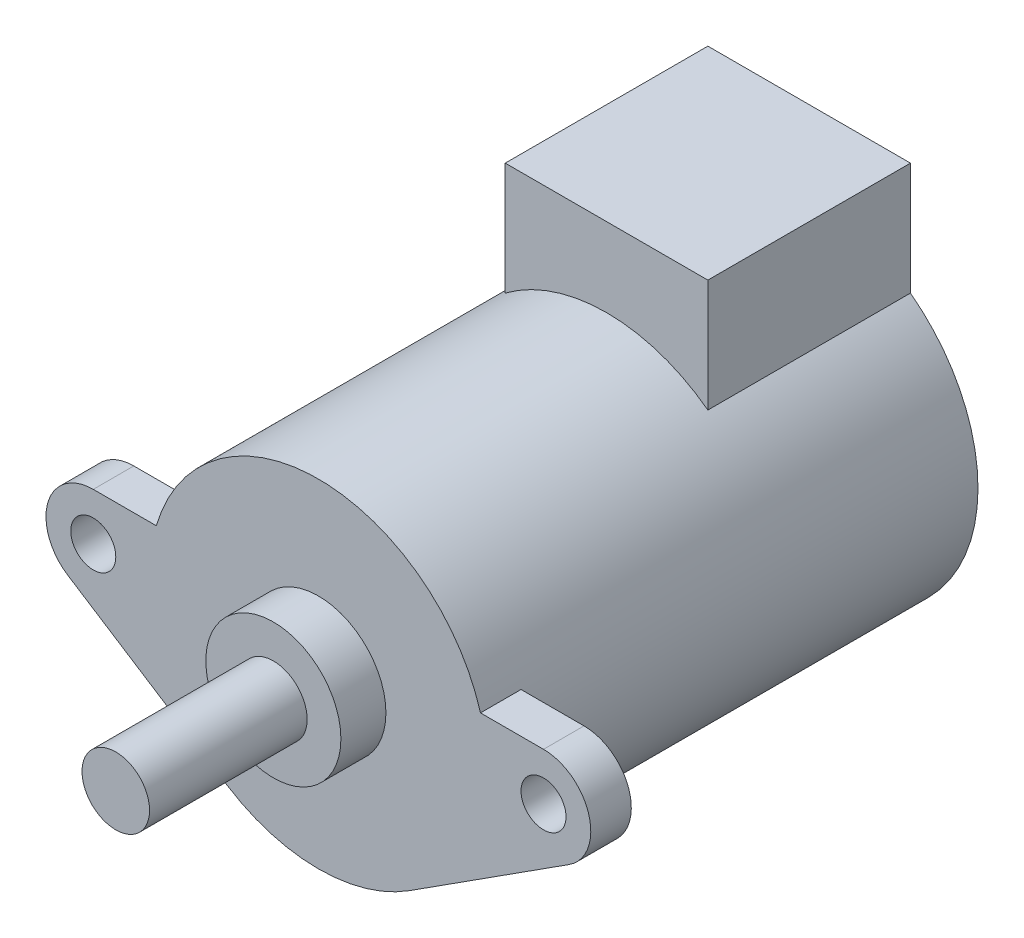
ISO-10303-21;
HEADER;
FILE_DESCRIPTION(('STEP AP214'),'2;1');
FILE_NAME('part.step','',(''),(''),'','','');
FILE_SCHEMA(('AUTOMOTIVE_DESIGN { 1 0 10303 214 1 1 1 1 }'));
ENDSEC;
DATA;
#1=APPLICATION_CONTEXT('core data for automotive mechanical design processes');
#2=APPLICATION_PROTOCOL_DEFINITION('international standard','automotive_design',2000,#1);
#3=PRODUCT_CONTEXT('',#1,'mechanical');
#4=PRODUCT('Part','Part','',(#3));
#5=PRODUCT_RELATED_PRODUCT_CATEGORY('part','',(#4));
#6=PRODUCT_DEFINITION_FORMATION('','',#4);
#7=PRODUCT_DEFINITION_CONTEXT('part definition',#1,'design');
#8=PRODUCT_DEFINITION('design','',#6,#7);
#9=PRODUCT_DEFINITION_SHAPE('','',#8);
#10=(LENGTH_UNIT() NAMED_UNIT(*) SI_UNIT(.MILLI.,.METRE.));
#11=(NAMED_UNIT(*) PLANE_ANGLE_UNIT() SI_UNIT($,.RADIAN.));
#12=(NAMED_UNIT(*) SI_UNIT($,.STERADIAN.) SOLID_ANGLE_UNIT());
#13=UNCERTAINTY_MEASURE_WITH_UNIT(LENGTH_MEASURE(1.E-05),#10,'distance_accuracy_value','');
#14=(GEOMETRIC_REPRESENTATION_CONTEXT(3) GLOBAL_UNCERTAINTY_ASSIGNED_CONTEXT((#13)) GLOBAL_UNIT_ASSIGNED_CONTEXT((#10,
#11,#12)) REPRESENTATION_CONTEXT('',''));
#15=CARTESIAN_POINT('',(0.,0.,0.));
#16=DIRECTION('',(0.,0.,1.));
#17=DIRECTION('',(1.,0.,0.));
#18=AXIS2_PLACEMENT_3D('',#15,#16,#17);
#19=CARTESIAN_POINT('',(0.,0.,10.8));
#20=DIRECTION('',(0.,0.,1.));
#21=DIRECTION('',(1.,0.,0.));
#22=AXIS2_PLACEMENT_3D('',#19,#20,#21);
#23=PLANE('',#22);
#24=CARTESIAN_POINT('',(0.,0.,10.8));
#25=DIRECTION('',(0.,0.,1.));
#26=DIRECTION('',(1.,0.,0.));
#27=AXIS2_PLACEMENT_3D('',#24,#25,#26);
#28=CIRCLE('',#27,1.5);
#29=CARTESIAN_POINT('',(1.5,0.,10.8));
#30=VERTEX_POINT('',#29);
#31=EDGE_CURVE('E20',#30,#30,#28,.F.);
#32=ORIENTED_EDGE('',*,*,#31,.F.);
#33=EDGE_LOOP('',(#32));
#34=FACE_BOUND('',#33,.T.);
#35=ADVANCED_FACE('F16',(#34),#23,.T.);
#36=CARTESIAN_POINT('',(0.,0.,3.8));
#37=DIRECTION('',(0.,0.,1.));
#38=DIRECTION('',(1.,0.,0.));
#39=AXIS2_PLACEMENT_3D('',#36,#37,#38);
#40=CYLINDRICAL_SURFACE('',#39,1.5);
#41=ORIENTED_EDGE('',*,*,#31,.T.);
#42=EDGE_LOOP('',(#41));
#43=FACE_BOUND('',#42,.T.);
#44=CARTESIAN_POINT('',(0.,0.,3.8));
#45=DIRECTION('',(0.,0.,1.));
#46=DIRECTION('',(1.,0.,0.));
#47=AXIS2_PLACEMENT_3D('',#44,#45,#46);
#48=CIRCLE('',#47,1.5);
#49=CARTESIAN_POINT('',(1.5,0.,3.8));
#50=VERTEX_POINT('',#49);
#51=EDGE_CURVE('E203',#50,#50,#48,.F.);
#52=ORIENTED_EDGE('',*,*,#51,.F.);
#53=EDGE_LOOP('',(#52));
#54=FACE_BOUND('',#53,.T.);
#55=ADVANCED_FACE('F210',(#43,#54),#40,.T.);
#56=CARTESIAN_POINT('',(0.,0.,-21.5));
#57=DIRECTION('',(0.,0.,-1.));
#58=DIRECTION('',(-1.,0.,0.));
#59=AXIS2_PLACEMENT_3D('',#56,#57,#58);
#60=PLANE('',#59);
#61=CARTESIAN_POINT('',(0.,0.,-21.5));
#62=DIRECTION('',(0.,0.,-1.));
#63=DIRECTION('',(-1.,0.,0.));
#64=AXIS2_PLACEMENT_3D('',#61,#62,#63);
#65=CIRCLE('',#64,1.);
#66=CARTESIAN_POINT('',(-1.,0.,-21.5));
#67=VERTEX_POINT('',#66);
#68=EDGE_CURVE('E201',#67,#67,#65,.F.);
#69=ORIENTED_EDGE('',*,*,#68,.F.);
#70=EDGE_LOOP('',(#69));
#71=FACE_BOUND('',#70,.T.);
#72=ADVANCED_FACE('F220',(#71),#60,.T.);
#73=CARTESIAN_POINT('',(0.,0.,3.8));
#74=DIRECTION('',(0.,0.,1.));
#75=DIRECTION('',(1.,0.,0.));
#76=AXIS2_PLACEMENT_3D('',#73,#74,#75);
#77=PLANE('',#76);
#78=ORIENTED_EDGE('',*,*,#51,.T.);
#79=EDGE_LOOP('',(#78));
#80=FACE_BOUND('',#79,.T.);
#81=CARTESIAN_POINT('',(0.,0.,3.8));
#82=DIRECTION('',(0.,0.,1.));
#83=DIRECTION('',(1.,0.,0.));
#84=AXIS2_PLACEMENT_3D('',#81,#82,#83);
#85=CIRCLE('',#84,3.);
#86=CARTESIAN_POINT('',(3.,0.,3.8));
#87=VERTEX_POINT('',#86);
#88=EDGE_CURVE('E126',#87,#87,#85,.F.);
#89=ORIENTED_EDGE('',*,*,#88,.F.);
#90=EDGE_LOOP('',(#89));
#91=FACE_BOUND('',#90,.T.);
#92=ADVANCED_FACE('F422',(#80,#91),#77,.T.);
#93=CARTESIAN_POINT('',(0.,0.,-20.));
#94=DIRECTION('',(0.,0.,-1.));
#95=DIRECTION('',(-1.,0.,0.));
#96=AXIS2_PLACEMENT_3D('',#93,#94,#95);
#97=CYLINDRICAL_SURFACE('',#96,1.);
#98=ORIENTED_EDGE('',*,*,#68,.T.);
#99=EDGE_LOOP('',(#98));
#100=FACE_BOUND('',#99,.T.);
#101=CARTESIAN_POINT('',(0.,0.,-20.));
#102=DIRECTION('',(0.,0.,-1.));
#103=DIRECTION('',(-1.,0.,0.));
#104=AXIS2_PLACEMENT_3D('',#101,#102,#103);
#105=CIRCLE('',#104,1.);
#106=CARTESIAN_POINT('',(-1.,0.,-20.));
#107=VERTEX_POINT('',#106);
#108=EDGE_CURVE('E149',#107,#107,#105,.F.);
#109=ORIENTED_EDGE('',*,*,#108,.F.);
#110=EDGE_LOOP('',(#109));
#111=FACE_BOUND('',#110,.T.);
#112=ADVANCED_FACE('F414',(#100,#111),#97,.T.);
#113=CARTESIAN_POINT('',(-10.,0.,0.));
#114=DIRECTION('',(0.,0.,1.));
#115=DIRECTION('',(1.,0.,0.));
#116=AXIS2_PLACEMENT_3D('',#113,#114,#115);
#117=CYLINDRICAL_SURFACE('',#116,2.1);
#118=DIRECTION('',(0.,0.,1.));
#119=VECTOR('',#118,1.);
#120=CARTESIAN_POINT('',(-10.,2.1,0.));
#121=LINE('',#120,#119);
#122=CARTESIAN_POINT('',(-10.,2.1,0.));
#123=VERTEX_POINT('',#122);
#124=CARTESIAN_POINT('',(-10.,2.1,1.8));
#125=VERTEX_POINT('',#124);
#126=EDGE_CURVE('E143',#123,#125,#121,.T.);
#127=ORIENTED_EDGE('',*,*,#126,.F.);
#128=CARTESIAN_POINT('',(-10.,0.,0.));
#129=DIRECTION('',(0.,0.,1.));
#130=DIRECTION('',(1.,0.,0.));
#131=AXIS2_PLACEMENT_3D('',#128,#129,#130);
#132=CIRCLE('',#131,2.1);
#133=CARTESIAN_POINT('',(-11.134,-1.76749653465003,0.));
#134=VERTEX_POINT('',#133);
#135=EDGE_CURVE('E153',#123,#134,#132,.T.);
#136=ORIENTED_EDGE('',*,*,#135,.T.);
#137=DIRECTION('',(0.,0.,1.));
#138=VECTOR('',#137,1.);
#139=CARTESIAN_POINT('',(-11.134,-1.76749653465,0.));
#140=LINE('',#139,#138);
#141=CARTESIAN_POINT('',(-11.134,-1.76749653465002,1.8));
#142=VERTEX_POINT('',#141);
#143=EDGE_CURVE('E150',#142,#134,#140,.F.);
#144=ORIENTED_EDGE('',*,*,#143,.F.);
#145=CARTESIAN_POINT('',(-10.,0.,1.8));
#146=DIRECTION('',(0.,0.,1.));
#147=DIRECTION('',(1.,0.,0.));
#148=AXIS2_PLACEMENT_3D('',#145,#146,#147);
#149=CIRCLE('',#148,2.1);
#150=EDGE_CURVE('E184',#125,#142,#149,.T.);
#151=ORIENTED_EDGE('',*,*,#150,.F.);
#152=EDGE_LOOP('',(#127,#136,#144,#151));
#153=FACE_BOUND('',#152,.T.);
#154=ADVANCED_FACE('F406',(#153),#117,.T.);
#155=CARTESIAN_POINT('',(-10.,0.,0.));
#156=DIRECTION('',(0.,0.,1.));
#157=DIRECTION('',(1.,0.,0.));
#158=AXIS2_PLACEMENT_3D('',#155,#156,#157);
#159=CYLINDRICAL_SURFACE('',#158,1.);
#160=CARTESIAN_POINT('',(-10.,0.,1.8));
#161=DIRECTION('',(0.,0.,1.));
#162=DIRECTION('',(1.,0.,0.));
#163=AXIS2_PLACEMENT_3D('',#160,#161,#162);
#164=CIRCLE('',#163,1.);
#165=CARTESIAN_POINT('',(-9.,0.,1.8));
#166=VERTEX_POINT('',#165);
#167=EDGE_CURVE('E181',#166,#166,#164,.F.);
#168=ORIENTED_EDGE('',*,*,#167,.F.);
#169=EDGE_LOOP('',(#168));
#170=FACE_BOUND('',#169,.T.);
#171=CARTESIAN_POINT('',(-10.,0.,0.));
#172=DIRECTION('',(0.,0.,1.));
#173=DIRECTION('',(1.,0.,0.));
#174=AXIS2_PLACEMENT_3D('',#171,#172,#173);
#175=CIRCLE('',#174,1.);
#176=CARTESIAN_POINT('',(-9.,0.,0.));
#177=VERTEX_POINT('',#176);
#178=EDGE_CURVE('E146',#177,#177,#175,.F.);
#179=ORIENTED_EDGE('',*,*,#178,.T.);
#180=EDGE_LOOP('',(#179));
#181=FACE_BOUND('',#180,.T.);
#182=ADVANCED_FACE('F398',(#170,#181),#159,.F.);
#183=CARTESIAN_POINT('',(10.,0.,0.));
#184=DIRECTION('',(0.,0.,1.));
#185=DIRECTION('',(1.,0.,0.));
#186=AXIS2_PLACEMENT_3D('',#183,#184,#185);
#187=CYLINDRICAL_SURFACE('',#186,1.);
#188=CARTESIAN_POINT('',(10.,0.,1.8));
#189=DIRECTION('',(0.,0.,1.));
#190=DIRECTION('',(1.,0.,0.));
#191=AXIS2_PLACEMENT_3D('',#188,#189,#190);
#192=CIRCLE('',#191,1.);
#193=CARTESIAN_POINT('',(11.,0.,1.8));
#194=VERTEX_POINT('',#193);
#195=EDGE_CURVE('E178',#194,#194,#192,.F.);
#196=ORIENTED_EDGE('',*,*,#195,.F.);
#197=EDGE_LOOP('',(#196));
#198=FACE_BOUND('',#197,.T.);
#199=CARTESIAN_POINT('',(10.,0.,0.));
#200=DIRECTION('',(0.,0.,1.));
#201=DIRECTION('',(1.,0.,0.));
#202=AXIS2_PLACEMENT_3D('',#199,#200,#201);
#203=CIRCLE('',#202,1.);
#204=CARTESIAN_POINT('',(11.,0.,0.));
#205=VERTEX_POINT('',#204);
#206=EDGE_CURVE('E125',#205,#205,#203,.F.);
#207=ORIENTED_EDGE('',*,*,#206,.T.);
#208=EDGE_LOOP('',(#207));
#209=FACE_BOUND('',#208,.T.);
#210=ADVANCED_FACE('F390',(#198,#209),#187,.F.);
#211=CARTESIAN_POINT('',(0.,0.,1.8));
#212=DIRECTION('',(0.,0.,1.));
#213=DIRECTION('',(1.,0.,0.));
#214=AXIS2_PLACEMENT_3D('',#211,#212,#213);
#215=CYLINDRICAL_SURFACE('',#214,3.);
#216=ORIENTED_EDGE('',*,*,#88,.T.);
#217=EDGE_LOOP('',(#216));
#218=FACE_BOUND('',#217,.T.);
#219=CARTESIAN_POINT('',(0.,0.,1.8));
#220=DIRECTION('',(0.,0.,1.));
#221=DIRECTION('',(1.,0.,0.));
#222=AXIS2_PLACEMENT_3D('',#219,#220,#221);
#223=CIRCLE('',#222,3.);
#224=CARTESIAN_POINT('',(3.,0.,1.8));
#225=VERTEX_POINT('',#224);
#226=EDGE_CURVE('E137',#225,#225,#223,.F.);
#227=ORIENTED_EDGE('',*,*,#226,.F.);
#228=EDGE_LOOP('',(#227));
#229=FACE_BOUND('',#228,.T.);
#230=ADVANCED_FACE('F383',(#218,#229),#215,.T.);
#231=CARTESIAN_POINT('',(10.,0.,0.));
#232=DIRECTION('',(0.,0.,1.));
#233=DIRECTION('',(1.,0.,0.));
#234=AXIS2_PLACEMENT_3D('',#231,#232,#233);
#235=CYLINDRICAL_SURFACE('',#234,2.1);
#236=DIRECTION('',(0.,0.,1.));
#237=VECTOR('',#236,1.);
#238=CARTESIAN_POINT('',(11.1339999999998,-1.76749653464975,0.));
#239=LINE('',#238,#237);
#240=CARTESIAN_POINT('',(11.1339999999998,-1.76749653464975,0.));
#241=VERTEX_POINT('',#240);
#242=CARTESIAN_POINT('',(11.1339999999999,-1.7674965346499,1.8));
#243=VERTEX_POINT('',#242);
#244=EDGE_CURVE('E71',#241,#243,#239,.T.);
#245=ORIENTED_EDGE('',*,*,#244,.F.);
#246=CARTESIAN_POINT('',(10.,0.,0.));
#247=DIRECTION('',(0.,0.,1.));
#248=DIRECTION('',(1.,0.,0.));
#249=AXIS2_PLACEMENT_3D('',#246,#247,#248);
#250=CIRCLE('',#249,2.1);
#251=CARTESIAN_POINT('',(10.,2.1,0.));
#252=VERTEX_POINT('',#251);
#253=EDGE_CURVE('E119',#241,#252,#250,.T.);
#254=ORIENTED_EDGE('',*,*,#253,.T.);
#255=DIRECTION('',(0.,0.,1.));
#256=VECTOR('',#255,1.);
#257=CARTESIAN_POINT('',(10.,2.1,0.));
#258=LINE('',#257,#256);
#259=CARTESIAN_POINT('',(10.,2.1,1.8));
#260=VERTEX_POINT('',#259);
#261=EDGE_CURVE('E122',#260,#252,#258,.F.);
#262=ORIENTED_EDGE('',*,*,#261,.F.);
#263=CARTESIAN_POINT('',(10.,0.,1.8));
#264=DIRECTION('',(0.,0.,1.));
#265=DIRECTION('',(1.,0.,0.));
#266=AXIS2_PLACEMENT_3D('',#263,#264,#265);
#267=CIRCLE('',#266,2.1);
#268=EDGE_CURVE('E188',#243,#260,#267,.T.);
#269=ORIENTED_EDGE('',*,*,#268,.F.);
#270=EDGE_LOOP('',(#245,#254,#262,#269));
#271=FACE_BOUND('',#270,.T.);
#272=ADVANCED_FACE('F120',(#271),#235,.T.);
#273=CARTESIAN_POINT('',(0.,0.,0.));
#274=DIRECTION('',(0.,0.,1.));
#275=DIRECTION('',(1.,0.,0.));
#276=AXIS2_PLACEMENT_3D('',#273,#274,#275);
#277=PLANE('',#276);
#278=ORIENTED_EDGE('',*,*,#206,.F.);
#279=EDGE_LOOP('',(#278));
#280=FACE_BOUND('',#279,.T.);
#281=ORIENTED_EDGE('',*,*,#253,.F.);
#282=DIRECTION('',(0.841665016500023,0.540000000000015,0.));
#283=VECTOR('',#282,1.);
#284=CARTESIAN_POINT('',(4.05,-6.31248762375,0.));
#285=LINE('',#284,#283);
#286=CARTESIAN_POINT('',(4.05000000000006,-6.31248762375009,0.));
#287=VERTEX_POINT('',#286);
#288=EDGE_CURVE('E148',#287,#241,#285,.T.);
#289=ORIENTED_EDGE('',*,*,#288,.F.);
#290=CARTESIAN_POINT('',(0.,0.,0.));
#291=DIRECTION('',(0.,0.,-1.));
#292=DIRECTION('',(-1.,0.,0.));
#293=AXIS2_PLACEMENT_3D('',#290,#291,#292);
#294=CIRCLE('',#293,7.5);
#295=CARTESIAN_POINT('',(7.2,2.1,0.));
#296=VERTEX_POINT('',#295);
#297=EDGE_CURVE('E35',#296,#287,#294,.T.);
#298=ORIENTED_EDGE('',*,*,#297,.F.);
#299=DIRECTION('',(1.,0.,0.));
#300=VECTOR('',#299,1.);
#301=CARTESIAN_POINT('',(10.,2.1,0.));
#302=LINE('',#301,#300);
#303=EDGE_CURVE('E128',#252,#296,#302,.F.);
#304=ORIENTED_EDGE('',*,*,#303,.F.);
#305=EDGE_LOOP('',(#281,#289,#298,#304));
#306=FACE_BOUND('',#305,.T.);
#307=ADVANCED_FACE('F129',(#280,#306),#277,.F.);
#308=CARTESIAN_POINT('',(4.5,0.,-20.));
#309=DIRECTION('',(1.,0.,0.));
#310=DIRECTION('',(0.,0.,-1.));
#311=AXIS2_PLACEMENT_3D('',#308,#309,#310);
#312=PLANE('',#311);
#313=DIRECTION('',(0.,1.,0.));
#314=VECTOR('',#313,1.);
#315=CARTESIAN_POINT('',(4.5,0.,-11.));
#316=LINE('',#315,#314);
#317=CARTESIAN_POINT('',(4.5,6.,-11.));
#318=VERTEX_POINT('',#317);
#319=CARTESIAN_POINT('',(4.5,11.,-11.));
#320=VERTEX_POINT('',#319);
#321=EDGE_CURVE('E248',#318,#320,#316,.T.);
#322=ORIENTED_EDGE('',*,*,#321,.F.);
#323=DIRECTION('',(0.,0.,-1.));
#324=VECTOR('',#323,1.);
#325=CARTESIAN_POINT('',(4.5,6.,0.));
#326=LINE('',#325,#324);
#327=CARTESIAN_POINT('',(4.5,6.,-20.));
#328=VERTEX_POINT('',#327);
#329=EDGE_CURVE('E141',#328,#318,#326,.F.);
#330=ORIENTED_EDGE('',*,*,#329,.F.);
#331=DIRECTION('',(0.,1.,0.));
#332=VECTOR('',#331,1.);
#333=CARTESIAN_POINT('',(4.5,0.,-20.));
#334=LINE('',#333,#332);
#335=CARTESIAN_POINT('',(4.5,11.,-20.));
#336=VERTEX_POINT('',#335);
#337=EDGE_CURVE('E157',#336,#328,#334,.F.);
#338=ORIENTED_EDGE('',*,*,#337,.F.);
#339=DIRECTION('',(0.,0.,1.));
#340=VECTOR('',#339,1.);
#341=CARTESIAN_POINT('',(4.5,11.,-20.));
#342=LINE('',#341,#340);
#343=EDGE_CURVE('E80',#320,#336,#342,.F.);
#344=ORIENTED_EDGE('',*,*,#343,.F.);
#345=EDGE_LOOP('',(#322,#330,#338,#344));
#346=FACE_BOUND('',#345,.T.);
#347=ADVANCED_FACE('F286',(#346),#312,.T.);
#348=CARTESIAN_POINT('',(4.5,11.,-20.));
#349=DIRECTION('',(0.,1.,0.));
#350=DIRECTION('',(0.,0.,1.));
#351=AXIS2_PLACEMENT_3D('',#348,#349,#350);
#352=PLANE('',#351);
#353=ORIENTED_EDGE('',*,*,#343,.T.);
#354=DIRECTION('',(-1.,0.,0.));
#355=VECTOR('',#354,1.);
#356=CARTESIAN_POINT('',(0.,11.,-20.));
#357=LINE('',#356,#355);
#358=CARTESIAN_POINT('',(-4.5,11.,-20.));
#359=VERTEX_POINT('',#358);
#360=EDGE_CURVE('E154',#359,#336,#357,.F.);
#361=ORIENTED_EDGE('',*,*,#360,.F.);
#362=DIRECTION('',(0.,0.,1.));
#363=VECTOR('',#362,1.);
#364=CARTESIAN_POINT('',(-4.5,11.,-20.));
#365=LINE('',#364,#363);
#366=CARTESIAN_POINT('',(-4.5,11.,-11.));
#367=VERTEX_POINT('',#366);
#368=EDGE_CURVE('E240',#367,#359,#365,.F.);
#369=ORIENTED_EDGE('',*,*,#368,.F.);
#370=DIRECTION('',(1.,0.,0.));
#371=VECTOR('',#370,1.);
#372=CARTESIAN_POINT('',(0.,11.,-11.));
#373=LINE('',#372,#371);
#374=EDGE_CURVE('E244',#320,#367,#373,.F.);
#375=ORIENTED_EDGE('',*,*,#374,.F.);
#376=EDGE_LOOP('',(#353,#361,#369,#375));
#377=FACE_BOUND('',#376,.T.);
#378=ADVANCED_FACE('F291',(#377),#352,.T.);
#379=CARTESIAN_POINT('',(-4.5,11.,-20.));
#380=DIRECTION('',(-1.,0.,0.));
#381=DIRECTION('',(0.,0.,1.));
#382=AXIS2_PLACEMENT_3D('',#379,#380,#381);
#383=PLANE('',#382);
#384=DIRECTION('',(0.,1.,0.));
#385=VECTOR('',#384,1.);
#386=CARTESIAN_POINT('',(-4.5,0.,-20.));
#387=LINE('',#386,#385);
#388=CARTESIAN_POINT('',(-4.5,6.,-20.));
#389=VERTEX_POINT('',#388);
#390=EDGE_CURVE('E158',#389,#359,#387,.T.);
#391=ORIENTED_EDGE('',*,*,#390,.F.);
#392=DIRECTION('',(0.,0.,1.));
#393=VECTOR('',#392,1.);
#394=CARTESIAN_POINT('',(-4.5,6.,0.));
#395=LINE('',#394,#393);
#396=CARTESIAN_POINT('',(-4.5,6.,-11.));
#397=VERTEX_POINT('',#396);
#398=EDGE_CURVE('E174',#397,#389,#395,.F.);
#399=ORIENTED_EDGE('',*,*,#398,.F.);
#400=DIRECTION('',(0.,1.,0.));
#401=VECTOR('',#400,1.);
#402=CARTESIAN_POINT('',(-4.5,0.,-11.));
#403=LINE('',#402,#401);
#404=EDGE_CURVE('E247',#367,#397,#403,.F.);
#405=ORIENTED_EDGE('',*,*,#404,.F.);
#406=ORIENTED_EDGE('',*,*,#368,.T.);
#407=EDGE_LOOP('',(#391,#399,#405,#406));
#408=FACE_BOUND('',#407,.T.);
#409=ADVANCED_FACE('F289',(#408),#383,.T.);
#410=CARTESIAN_POINT('',(0.,0.,-20.));
#411=DIRECTION('',(0.,0.,-1.));
#412=DIRECTION('',(-1.,0.,0.));
#413=AXIS2_PLACEMENT_3D('',#410,#411,#412);
#414=PLANE('',#413);
#415=ORIENTED_EDGE('',*,*,#108,.T.);
#416=EDGE_LOOP('',(#415));
#417=FACE_BOUND('',#416,.T.);
#418=ORIENTED_EDGE('',*,*,#337,.T.);
#419=CARTESIAN_POINT('',(0.,0.,-20.));
#420=DIRECTION('',(0.,0.,1.));
#421=DIRECTION('',(1.,0.,0.));
#422=AXIS2_PLACEMENT_3D('',#419,#420,#421);
#423=CIRCLE('',#422,7.5);
#424=EDGE_CURVE('E116',#389,#328,#423,.T.);
#425=ORIENTED_EDGE('',*,*,#424,.F.);
#426=ORIENTED_EDGE('',*,*,#390,.T.);
#427=ORIENTED_EDGE('',*,*,#360,.T.);
#428=EDGE_LOOP('',(#418,#425,#426,#427));
#429=FACE_BOUND('',#428,.T.);
#430=ADVANCED_FACE('F284',(#417,#429),#414,.T.);
#431=CARTESIAN_POINT('',(4.05,-6.31248762375,0.));
#432=DIRECTION('',(0.540000000000015,-0.841665016500023,0.));
#433=DIRECTION('',(0.841665016500023,0.540000000000015,0.));
#434=AXIS2_PLACEMENT_3D('',#431,#432,#433);
#435=PLANE('',#434);
#436=DIRECTION('',(0.,0.,1.));
#437=VECTOR('',#436,1.);
#438=CARTESIAN_POINT('',(4.05000000000011,-6.31248762375017,0.));
#439=LINE('',#438,#437);
#440=CARTESIAN_POINT('',(4.04999999999994,-6.31248762375016,1.8));
#441=VERTEX_POINT('',#440);
#442=EDGE_CURVE('E172',#287,#441,#439,.T.);
#443=ORIENTED_EDGE('',*,*,#442,.F.);
#444=ORIENTED_EDGE('',*,*,#288,.T.);
#445=ORIENTED_EDGE('',*,*,#244,.T.);
#446=DIRECTION('',(0.841665016500042,0.539999999999985,0.));
#447=VECTOR('',#446,1.);
#448=CARTESIAN_POINT('',(4.05,-6.31248762375,1.8));
#449=LINE('',#448,#447);
#450=EDGE_CURVE('E190',#441,#243,#449,.T.);
#451=ORIENTED_EDGE('',*,*,#450,.F.);
#452=EDGE_LOOP('',(#443,#444,#445,#451));
#453=FACE_BOUND('',#452,.T.);
#454=ADVANCED_FACE('F232',(#453),#435,.T.);
#455=CARTESIAN_POINT('',(-11.134,-1.76749653465,0.));
#456=DIRECTION('',(-0.540000000000015,-0.841665016500023,0.));
#457=DIRECTION('',(0.841665016500023,-0.540000000000015,0.));
#458=AXIS2_PLACEMENT_3D('',#455,#456,#457);
#459=PLANE('',#458);
#460=ORIENTED_EDGE('',*,*,#143,.T.);
#461=DIRECTION('',(0.841665016500048,-0.539999999999976,0.));
#462=VECTOR('',#461,1.);
#463=CARTESIAN_POINT('',(-11.134,-1.76749653465,0.));
#464=LINE('',#463,#462);
#465=CARTESIAN_POINT('',(-4.04999999999989,-6.31248762375014,0.));
#466=VERTEX_POINT('',#465);
#467=EDGE_CURVE('E193',#134,#466,#464,.T.);
#468=ORIENTED_EDGE('',*,*,#467,.T.);
#469=DIRECTION('',(0.,0.,1.));
#470=VECTOR('',#469,1.);
#471=CARTESIAN_POINT('',(-4.05000000000011,-6.31248762375017,0.));
#472=LINE('',#471,#470);
#473=CARTESIAN_POINT('',(-4.04999999999995,-6.31248762375016,1.8));
#474=VERTEX_POINT('',#473);
#475=EDGE_CURVE('E168',#474,#466,#472,.F.);
#476=ORIENTED_EDGE('',*,*,#475,.F.);
#477=DIRECTION('',(0.841665016500042,-0.539999999999985,0.));
#478=VECTOR('',#477,1.);
#479=CARTESIAN_POINT('',(-11.134,-1.76749653465,1.8));
#480=LINE('',#479,#478);
#481=EDGE_CURVE('E264',#142,#474,#480,.T.);
#482=ORIENTED_EDGE('',*,*,#481,.F.);
#483=EDGE_LOOP('',(#460,#468,#476,#482));
#484=FACE_BOUND('',#483,.T.);
#485=ADVANCED_FACE('F308',(#484),#459,.T.);
#486=CARTESIAN_POINT('',(0.,0.,0.));
#487=DIRECTION('',(0.,0.,1.));
#488=DIRECTION('',(1.,0.,0.));
#489=AXIS2_PLACEMENT_3D('',#486,#487,#488);
#490=PLANE('',#489);
#491=ORIENTED_EDGE('',*,*,#178,.F.);
#492=EDGE_LOOP('',(#491));
#493=FACE_BOUND('',#492,.T.);
#494=ORIENTED_EDGE('',*,*,#135,.F.);
#495=DIRECTION('',(1.,0.,0.));
#496=VECTOR('',#495,1.);
#497=CARTESIAN_POINT('',(-7.2,2.1,0.));
#498=LINE('',#497,#496);
#499=CARTESIAN_POINT('',(-7.2,2.1,0.));
#500=VERTEX_POINT('',#499);
#501=EDGE_CURVE('E145',#500,#123,#498,.F.);
#502=ORIENTED_EDGE('',*,*,#501,.F.);
#503=CARTESIAN_POINT('',(0.,0.,0.));
#504=DIRECTION('',(0.,0.,1.));
#505=DIRECTION('',(1.,0.,0.));
#506=AXIS2_PLACEMENT_3D('',#503,#504,#505);
#507=CIRCLE('',#506,7.5);
#508=EDGE_CURVE('E165',#466,#500,#507,.F.);
#509=ORIENTED_EDGE('',*,*,#508,.F.);
#510=ORIENTED_EDGE('',*,*,#467,.F.);
#511=EDGE_LOOP('',(#494,#502,#509,#510));
#512=FACE_BOUND('',#511,.T.);
#513=ADVANCED_FACE('F311',(#493,#512),#490,.F.);
#514=CARTESIAN_POINT('',(-7.2,2.1,0.));
#515=DIRECTION('',(0.,1.,0.));
#516=DIRECTION('',(0.,0.,1.));
#517=AXIS2_PLACEMENT_3D('',#514,#515,#516);
#518=PLANE('',#517);
#519=DIRECTION('',(0.,0.,1.));
#520=VECTOR('',#519,1.);
#521=CARTESIAN_POINT('',(-7.2,2.1,0.));
#522=LINE('',#521,#520);
#523=CARTESIAN_POINT('',(-7.2,2.1,1.8));
#524=VERTEX_POINT('',#523);
#525=EDGE_CURVE('E164',#500,#524,#522,.T.);
#526=ORIENTED_EDGE('',*,*,#525,.F.);
#527=ORIENTED_EDGE('',*,*,#501,.T.);
#528=ORIENTED_EDGE('',*,*,#126,.T.);
#529=DIRECTION('',(1.,0.,0.));
#530=VECTOR('',#529,1.);
#531=CARTESIAN_POINT('',(0.,2.1,1.8));
#532=LINE('',#531,#530);
#533=EDGE_CURVE('E187',#524,#125,#532,.F.);
#534=ORIENTED_EDGE('',*,*,#533,.F.);
#535=EDGE_LOOP('',(#526,#527,#528,#534));
#536=FACE_BOUND('',#535,.T.);
#537=ADVANCED_FACE('F315',(#536),#518,.T.);
#538=CARTESIAN_POINT('',(0.,0.,1.8));
#539=DIRECTION('',(0.,0.,1.));
#540=DIRECTION('',(1.,0.,0.));
#541=AXIS2_PLACEMENT_3D('',#538,#539,#540);
#542=PLANE('',#541);
#543=ORIENTED_EDGE('',*,*,#226,.T.);
#544=EDGE_LOOP('',(#543));
#545=FACE_BOUND('',#544,.T.);
#546=ORIENTED_EDGE('',*,*,#195,.T.);
#547=EDGE_LOOP('',(#546));
#548=FACE_BOUND('',#547,.T.);
#549=ORIENTED_EDGE('',*,*,#167,.T.);
#550=EDGE_LOOP('',(#549));
#551=FACE_BOUND('',#550,.T.);
#552=ORIENTED_EDGE('',*,*,#533,.T.);
#553=ORIENTED_EDGE('',*,*,#150,.T.);
#554=ORIENTED_EDGE('',*,*,#481,.T.);
#555=CARTESIAN_POINT('',(0.,0.,1.8));
#556=DIRECTION('',(0.,0.,1.));
#557=DIRECTION('',(1.,0.,0.));
#558=AXIS2_PLACEMENT_3D('',#555,#556,#557);
#559=CIRCLE('',#558,7.5);
#560=EDGE_CURVE('E169',#441,#474,#559,.F.);
#561=ORIENTED_EDGE('',*,*,#560,.F.);
#562=ORIENTED_EDGE('',*,*,#450,.T.);
#563=ORIENTED_EDGE('',*,*,#268,.T.);
#564=DIRECTION('',(1.,0.,0.));
#565=VECTOR('',#564,1.);
#566=CARTESIAN_POINT('',(10.,2.1,1.8));
#567=LINE('',#566,#565);
#568=CARTESIAN_POINT('',(7.2,2.1,1.8));
#569=VERTEX_POINT('',#568);
#570=EDGE_CURVE('E135',#569,#260,#567,.T.);
#571=ORIENTED_EDGE('',*,*,#570,.F.);
#572=CARTESIAN_POINT('',(0.,0.,1.8));
#573=DIRECTION('',(0.,0.,1.));
#574=DIRECTION('',(1.,0.,0.));
#575=AXIS2_PLACEMENT_3D('',#572,#573,#574);
#576=CIRCLE('',#575,7.5);
#577=EDGE_CURVE('E161',#524,#569,#576,.F.);
#578=ORIENTED_EDGE('',*,*,#577,.F.);
#579=EDGE_LOOP('',(#552,#553,#554,#561,#562,#563,#571,#578));
#580=FACE_BOUND('',#579,.T.);
#581=ADVANCED_FACE('F319',(#545,#548,#551,#580),#542,.T.);
#582=CARTESIAN_POINT('',(10.,2.1,0.));
#583=DIRECTION('',(0.,1.,0.));
#584=DIRECTION('',(0.,0.,1.));
#585=AXIS2_PLACEMENT_3D('',#582,#583,#584);
#586=PLANE('',#585);
#587=ORIENTED_EDGE('',*,*,#261,.T.);
#588=ORIENTED_EDGE('',*,*,#303,.T.);
#589=DIRECTION('',(0.,0.,1.));
#590=VECTOR('',#589,1.);
#591=CARTESIAN_POINT('',(7.2,2.1,0.));
#592=LINE('',#591,#590);
#593=EDGE_CURVE('E26',#569,#296,#592,.F.);
#594=ORIENTED_EDGE('',*,*,#593,.F.);
#595=ORIENTED_EDGE('',*,*,#570,.T.);
#596=EDGE_LOOP('',(#587,#588,#594,#595));
#597=FACE_BOUND('',#596,.T.);
#598=ADVANCED_FACE('F134',(#597),#586,.T.);
#599=CARTESIAN_POINT('',(0.,0.,-11.));
#600=DIRECTION('',(0.,0.,1.));
#601=DIRECTION('',(1.,0.,0.));
#602=AXIS2_PLACEMENT_3D('',#599,#600,#601);
#603=PLANE('',#602);
#604=ORIENTED_EDGE('',*,*,#404,.T.);
#605=CARTESIAN_POINT('',(0.,0.,-11.));
#606=DIRECTION('',(0.,0.,1.));
#607=DIRECTION('',(1.,0.,0.));
#608=AXIS2_PLACEMENT_3D('',#605,#606,#607);
#609=CIRCLE('',#608,7.5);
#610=EDGE_CURVE('E11',#318,#397,#609,.T.);
#611=ORIENTED_EDGE('',*,*,#610,.F.);
#612=ORIENTED_EDGE('',*,*,#321,.T.);
#613=ORIENTED_EDGE('',*,*,#374,.T.);
#614=EDGE_LOOP('',(#604,#611,#612,#613));
#615=FACE_BOUND('',#614,.T.);
#616=ADVANCED_FACE('F223',(#615),#603,.T.);
#617=CARTESIAN_POINT('',(0.,0.,0.));
#618=DIRECTION('',(0.,0.,1.));
#619=DIRECTION('',(1.,0.,0.));
#620=AXIS2_PLACEMENT_3D('',#617,#618,#619);
#621=CYLINDRICAL_SURFACE('',#620,7.5);
#622=ORIENTED_EDGE('',*,*,#297,.T.);
#623=ORIENTED_EDGE('',*,*,#442,.T.);
#624=ORIENTED_EDGE('',*,*,#560,.T.);
#625=ORIENTED_EDGE('',*,*,#475,.T.);
#626=ORIENTED_EDGE('',*,*,#508,.T.);
#627=ORIENTED_EDGE('',*,*,#525,.T.);
#628=ORIENTED_EDGE('',*,*,#577,.T.);
#629=ORIENTED_EDGE('',*,*,#593,.T.);
#630=EDGE_LOOP('',(#622,#623,#624,#625,#626,#627,#628,#629));
#631=FACE_BOUND('',#630,.T.);
#632=ORIENTED_EDGE('',*,*,#424,.T.);
#633=ORIENTED_EDGE('',*,*,#329,.T.);
#634=ORIENTED_EDGE('',*,*,#610,.T.);
#635=ORIENTED_EDGE('',*,*,#398,.T.);
#636=EDGE_LOOP('',(#632,#633,#634,#635));
#637=FACE_BOUND('',#636,.T.);
#638=ADVANCED_FACE('F18',(#631,#637),#621,.T.);
#639=CLOSED_SHELL('',(#35,#55,#72,#92,#112,#154,#182,#210,#230,#272,#307,#347,#378,#409,#430,
#454,#485,#513,#537,#581,#598,#616,#638));
#640=MANIFOLD_SOLID_BREP('B1',#639);
#641=ADVANCED_BREP_SHAPE_REPRESENTATION('',(#18,#640),#14);
#642=SHAPE_DEFINITION_REPRESENTATION(#9,#641);
ENDSEC;
END-ISO-10303-21;
